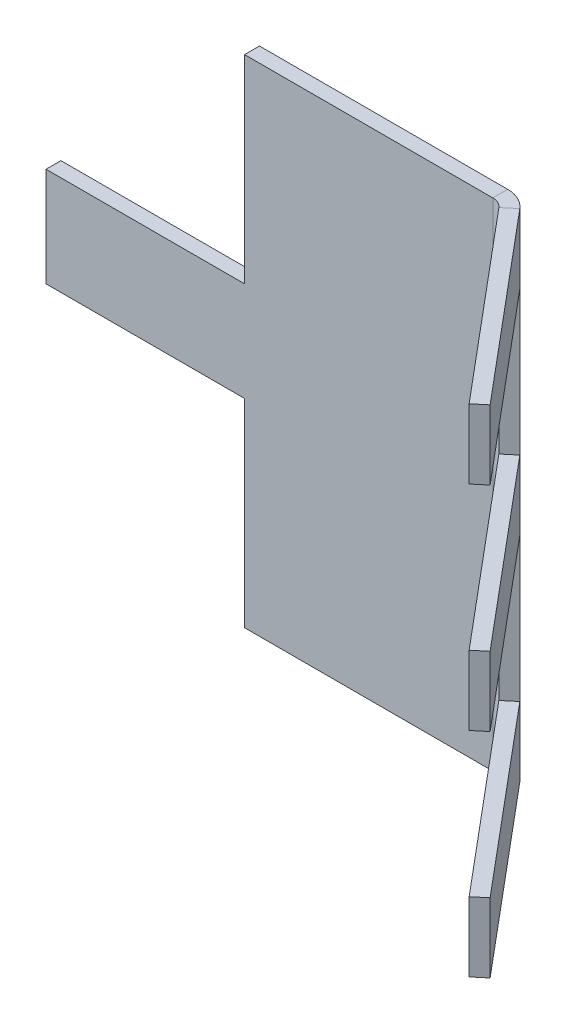
ISO-10303-21;
HEADER;
FILE_DESCRIPTION(('STEP AP214'),'2;1');
FILE_NAME('part.step','',(''),(''),'','','');
FILE_SCHEMA(('AUTOMOTIVE_DESIGN { 1 0 10303 214 1 1 1 1 }'));
ENDSEC;
DATA;
#1=APPLICATION_CONTEXT('core data for automotive mechanical design processes');
#2=APPLICATION_PROTOCOL_DEFINITION('international standard','automotive_design',2000,#1);
#3=PRODUCT_CONTEXT('',#1,'mechanical');
#4=PRODUCT('Part','Part','',(#3));
#5=PRODUCT_RELATED_PRODUCT_CATEGORY('part','',(#4));
#6=PRODUCT_DEFINITION_FORMATION('','',#4);
#7=PRODUCT_DEFINITION_CONTEXT('part definition',#1,'design');
#8=PRODUCT_DEFINITION('design','',#6,#7);
#9=PRODUCT_DEFINITION_SHAPE('','',#8);
#10=(LENGTH_UNIT() NAMED_UNIT(*) SI_UNIT(.MILLI.,.METRE.));
#11=(NAMED_UNIT(*) PLANE_ANGLE_UNIT() SI_UNIT($,.RADIAN.));
#12=(NAMED_UNIT(*) SI_UNIT($,.STERADIAN.) SOLID_ANGLE_UNIT());
#13=UNCERTAINTY_MEASURE_WITH_UNIT(LENGTH_MEASURE(1.E-05),#10,'distance_accuracy_value','');
#14=(GEOMETRIC_REPRESENTATION_CONTEXT(3) GLOBAL_UNCERTAINTY_ASSIGNED_CONTEXT((#13)) GLOBAL_UNIT_ASSIGNED_CONTEXT((#10,
#11,#12)) REPRESENTATION_CONTEXT('',''));
#15=CARTESIAN_POINT('',(0.,0.,0.));
#16=DIRECTION('',(0.,0.,1.));
#17=DIRECTION('',(1.,0.,0.));
#18=AXIS2_PLACEMENT_3D('',#15,#16,#17);
#19=CARTESIAN_POINT('',(-36.5711252653928,26.963906581741,-3.));
#20=DIRECTION('',(-1.,0.,0.));
#21=DIRECTION('',(0.,-1.,0.));
#22=AXIS2_PLACEMENT_3D('',#19,#20,#21);
#23=PLANE('',#22);
#24=DIRECTION('',(0.,0.,-1.));
#25=VECTOR('',#24,1.);
#26=CARTESIAN_POINT('',(-36.5711252653928,-13.036093418259,-3.));
#27=LINE('',#26,#25);
#28=CARTESIAN_POINT('',(-36.5711252653928,-13.036093418259,0.));
#29=VERTEX_POINT('',#28);
#30=CARTESIAN_POINT('',(-36.5711252653928,-13.036093418259,-3.));
#31=VERTEX_POINT('',#30);
#32=EDGE_CURVE('E228',#29,#31,#27,.T.);
#33=ORIENTED_EDGE('',*,*,#32,.F.);
#34=DIRECTION('',(0.,-1.,0.));
#35=VECTOR('',#34,1.);
#36=CARTESIAN_POINT('',(-36.5711252653928,26.963906581741,0.));
#37=LINE('',#36,#35);
#38=CARTESIAN_POINT('',(-36.5711252653928,26.963906581741,0.));
#39=VERTEX_POINT('',#38);
#40=EDGE_CURVE('E343',#39,#29,#37,.T.);
#41=ORIENTED_EDGE('',*,*,#40,.F.);
#42=DIRECTION('',(0.,0.,1.));
#43=VECTOR('',#42,1.);
#44=CARTESIAN_POINT('',(-36.5711252653928,26.963906581741,-3.));
#45=LINE('',#44,#43);
#46=CARTESIAN_POINT('',(-36.5711252653928,26.963906581741,-3.));
#47=VERTEX_POINT('',#46);
#48=EDGE_CURVE('E354',#47,#39,#45,.T.);
#49=ORIENTED_EDGE('',*,*,#48,.F.);
#50=DIRECTION('',(0.,-1.,0.));
#51=VECTOR('',#50,1.);
#52=CARTESIAN_POINT('',(-36.5711252653928,26.963906581741,-3.));
#53=LINE('',#52,#51);
#54=EDGE_CURVE('E330',#47,#31,#53,.T.);
#55=ORIENTED_EDGE('',*,*,#54,.T.);
#56=EDGE_LOOP('',(#33,#41,#49,#55));
#57=FACE_BOUND('',#56,.T.);
#58=ADVANCED_FACE('F57',(#57),#23,.T.);
#59=CARTESIAN_POINT('',(11.5774434840165,0.,-8.54079280549512));
#60=DIRECTION('',(-0.766044443118975,0.,0.642787609686544));
#61=DIRECTION('',(0.642787609686544,0.,0.766044443118975));
#62=AXIS2_PLACEMENT_3D('',#59,#60,#61);
#63=PLANE('',#62);
#64=DIRECTION('',(0.,1.,0.));
#65=VECTOR('',#64,1.);
#66=CARTESIAN_POINT('',(18.0251413933211,-73.036093418259,-0.85672565811926));
#67=LINE('',#66,#65);
#68=CARTESIAN_POINT('',(18.0251413933211,-59.036093418259,-0.856725658119256));
#69=VERTEX_POINT('',#68);
#70=CARTESIAN_POINT('',(18.0251413933211,-73.036093418259,-0.856725658119263));
#71=VERTEX_POINT('',#70);
#72=EDGE_CURVE('E307',#69,#71,#67,.F.);
#73=ORIENTED_EDGE('',*,*,#72,.F.);
#74=DIRECTION('',(0.642787609686544,0.,0.766044443118974));
#75=VECTOR('',#74,1.);
#76=CARTESIAN_POINT('',(11.5774434840165,-59.0360934182591,-8.54079280549511));
#77=LINE('',#76,#75);
#78=CARTESIAN_POINT('',(49.2653115227563,-59.036093418259,36.3738593268891));
#79=VERTEX_POINT('',#78);
#80=EDGE_CURVE('E250',#69,#79,#77,.T.);
#81=ORIENTED_EDGE('',*,*,#80,.T.);
#82=DIRECTION('',(0.,-1.,0.));
#83=VECTOR('',#82,1.);
#84=CARTESIAN_POINT('',(49.2653115227563,0.,36.3738593268891));
#85=LINE('',#84,#83);
#86=CARTESIAN_POINT('',(49.2653115227563,-73.036093418259,36.3738593268891));
#87=VERTEX_POINT('',#86);
#88=EDGE_CURVE('E290',#79,#87,#85,.T.);
#89=ORIENTED_EDGE('',*,*,#88,.T.);
#90=DIRECTION('',(-0.642787609686544,0.,-0.766044443118975));
#91=VECTOR('',#90,1.);
#92=CARTESIAN_POINT('',(11.5774434840165,-73.036093418259,-8.54079280549512));
#93=LINE('',#92,#91);
#94=EDGE_CURVE('E283',#87,#71,#93,.T.);
#95=ORIENTED_EDGE('',*,*,#94,.T.);
#96=EDGE_LOOP('',(#73,#81,#89,#95));
#97=FACE_BOUND('',#96,.T.);
#98=ADVANCED_FACE('F420',(#97),#63,.F.);
#99=CARTESIAN_POINT('',(9.27931015465954,0.,-6.61242997643549));
#100=DIRECTION('',(-0.766044443118975,0.,0.642787609686544));
#101=DIRECTION('',(0.642787609686544,0.,0.766044443118975));
#102=AXIS2_PLACEMENT_3D('',#99,#100,#101);
#103=PLANE('',#102);
#104=DIRECTION('',(0.642787609686544,0.,0.766044443118974));
#105=VECTOR('',#104,1.);
#106=CARTESIAN_POINT('',(46.9671781933994,-59.036093418259,38.3022221559487));
#107=LINE('',#106,#105);
#108=CARTESIAN_POINT('',(15.7270080639642,-59.036093418259,1.07163717094037));
#109=VERTEX_POINT('',#108);
#110=CARTESIAN_POINT('',(46.9671781933994,-59.036093418259,38.3022221559487));
#111=VERTEX_POINT('',#110);
#112=EDGE_CURVE('E234',#109,#111,#107,.T.);
#113=ORIENTED_EDGE('',*,*,#112,.F.);
#114=DIRECTION('',(0.,1.,0.));
#115=VECTOR('',#114,1.);
#116=CARTESIAN_POINT('',(15.7270080639642,-73.036093418259,1.07163717094037));
#117=LINE('',#116,#115);
#118=CARTESIAN_POINT('',(15.7270080639642,-73.036093418259,1.07163717094037));
#119=VERTEX_POINT('',#118);
#120=EDGE_CURVE('E311',#119,#109,#117,.T.);
#121=ORIENTED_EDGE('',*,*,#120,.F.);
#122=DIRECTION('',(0.642787609686544,0.,0.766044443118975));
#123=VECTOR('',#122,1.);
#124=CARTESIAN_POINT('',(14.8277977090722,-73.036093418259,0.));
#125=LINE('',#124,#123);
#126=CARTESIAN_POINT('',(46.9671781933994,-73.036093418259,38.3022221559487));
#127=VERTEX_POINT('',#126);
#128=EDGE_CURVE('E293',#127,#119,#125,.F.);
#129=ORIENTED_EDGE('',*,*,#128,.F.);
#130=DIRECTION('',(0.,1.,0.));
#131=VECTOR('',#130,1.);
#132=CARTESIAN_POINT('',(46.9671781933994,-73.036093418259,38.3022221559487));
#133=LINE('',#132,#131);
#134=EDGE_CURVE('E300',#111,#127,#133,.F.);
#135=ORIENTED_EDGE('',*,*,#134,.F.);
#136=EDGE_LOOP('',(#113,#121,#129,#135));
#137=FACE_BOUND('',#136,.T.);
#138=ADVANCED_FACE('F434',(#137),#103,.T.);
#139=CARTESIAN_POINT('',(49.2653115227563,-73.036093418259,36.3738593268891));
#140=DIRECTION('',(-0.642787609686543,0.,-0.766044443118974));
#141=DIRECTION('',(-0.766044443118975,0.,0.642787609686544));
#142=AXIS2_PLACEMENT_3D('',#139,#140,#141);
#143=PLANE('',#142);
#144=ORIENTED_EDGE('',*,*,#88,.F.);
#145=DIRECTION('',(-0.766044443118974,0.,0.642787609686544));
#146=VECTOR('',#145,1.);
#147=CARTESIAN_POINT('',(69.1824670438497,-59.036093418259,19.6613814750389));
#148=LINE('',#147,#146);
#149=EDGE_CURVE('E237',#79,#111,#148,.T.);
#150=ORIENTED_EDGE('',*,*,#149,.T.);
#151=ORIENTED_EDGE('',*,*,#134,.T.);
#152=DIRECTION('',(-0.766044443118975,0.,0.642787609686544));
#153=VECTOR('',#152,1.);
#154=CARTESIAN_POINT('',(49.2653115227563,-73.036093418259,36.3738593268891));
#155=LINE('',#154,#153);
#156=EDGE_CURVE('E280',#87,#127,#155,.T.);
#157=ORIENTED_EDGE('',*,*,#156,.F.);
#158=EDGE_LOOP('',(#144,#150,#151,#157));
#159=FACE_BOUND('',#158,.T.);
#160=ADVANCED_FACE('F423',(#159),#143,.F.);
#161=CARTESIAN_POINT('',(49.2653115227563,-16.036093418259,36.3738593268891));
#162=VERTEX_POINT('',#161);
#163=CARTESIAN_POINT('',(49.2653115227563,-30.036093418259,36.3738593268891));
#164=VERTEX_POINT('',#163);
#165=EDGE_CURVE('E289',#162,#164,#85,.T.);
#166=ORIENTED_EDGE('',*,*,#165,.T.);
#167=DIRECTION('',(-0.642787609686544,0.,-0.766044443118975));
#168=VECTOR('',#167,1.);
#169=CARTESIAN_POINT('',(11.5774434840165,-30.036093418259,-8.54079280549512));
#170=LINE('',#169,#168);
#171=CARTESIAN_POINT('',(18.0251413933211,-30.036093418259,-0.856725658119255));
#172=VERTEX_POINT('',#171);
#173=EDGE_CURVE('E240',#164,#172,#170,.T.);
#174=ORIENTED_EDGE('',*,*,#173,.T.);
#175=CARTESIAN_POINT('',(18.0251413933211,-16.036093418259,-0.856725658119256));
#176=VERTEX_POINT('',#175);
#177=EDGE_CURVE('E306',#176,#172,#67,.F.);
#178=ORIENTED_EDGE('',*,*,#177,.F.);
#179=DIRECTION('',(0.642787609686544,0.,0.766044443118975));
#180=VECTOR('',#179,1.);
#181=CARTESIAN_POINT('',(11.5774434840165,-16.036093418259,-8.54079280549512));
#182=LINE('',#181,#180);
#183=EDGE_CURVE('E269',#176,#162,#182,.T.);
#184=ORIENTED_EDGE('',*,*,#183,.T.);
#185=EDGE_LOOP('',(#166,#174,#178,#184));
#186=FACE_BOUND('',#185,.T.);
#187=ADVANCED_FACE('F410',(#186),#63,.F.);
#188=DIRECTION('',(-0.642787609686544,0.,-0.766044443118974));
#189=VECTOR('',#188,1.);
#190=CARTESIAN_POINT('',(46.9671781933994,-30.036093418259,38.3022221559487));
#191=LINE('',#190,#189);
#192=CARTESIAN_POINT('',(46.9671781933994,-30.036093418259,38.3022221559487));
#193=VERTEX_POINT('',#192);
#194=CARTESIAN_POINT('',(15.7270080639642,-30.036093418259,1.07163717094038));
#195=VERTEX_POINT('',#194);
#196=EDGE_CURVE('E80',#193,#195,#191,.T.);
#197=ORIENTED_EDGE('',*,*,#196,.F.);
#198=CARTESIAN_POINT('',(46.9671781933994,-16.036093418259,38.3022221559487));
#199=VERTEX_POINT('',#198);
#200=EDGE_CURVE('E299',#199,#193,#133,.F.);
#201=ORIENTED_EDGE('',*,*,#200,.F.);
#202=DIRECTION('',(0.642787609686544,0.,0.766044443118974));
#203=VECTOR('',#202,1.);
#204=CARTESIAN_POINT('',(46.9671781933994,-16.036093418259,38.3022221559487));
#205=LINE('',#204,#203);
#206=CARTESIAN_POINT('',(15.7270080639642,-16.036093418259,1.07163717094037));
#207=VERTEX_POINT('',#206);
#208=EDGE_CURVE('E259',#207,#199,#205,.T.);
#209=ORIENTED_EDGE('',*,*,#208,.F.);
#210=EDGE_CURVE('E314',#195,#207,#117,.T.);
#211=ORIENTED_EDGE('',*,*,#210,.F.);
#212=EDGE_LOOP('',(#197,#201,#209,#211));
#213=FACE_BOUND('',#212,.T.);
#214=ADVANCED_FACE('F441',(#213),#103,.T.);
#215=ORIENTED_EDGE('',*,*,#200,.T.);
#216=DIRECTION('',(-0.766044443118974,0.,0.642787609686544));
#217=VECTOR('',#216,1.);
#218=CARTESIAN_POINT('',(69.1824670438497,-30.036093418259,19.6613814750389));
#219=LINE('',#218,#217);
#220=EDGE_CURVE('E236',#164,#193,#219,.T.);
#221=ORIENTED_EDGE('',*,*,#220,.F.);
#222=ORIENTED_EDGE('',*,*,#165,.F.);
#223=DIRECTION('',(-0.766044443118975,0.,0.642787609686544));
#224=VECTOR('',#223,1.);
#225=CARTESIAN_POINT('',(49.2653115227563,-16.036093418259,36.3738593268891));
#226=LINE('',#225,#224);
#227=EDGE_CURVE('E13',#162,#199,#226,.T.);
#228=ORIENTED_EDGE('',*,*,#227,.T.);
#229=EDGE_LOOP('',(#215,#221,#222,#228));
#230=FACE_BOUND('',#229,.T.);
#231=ADVANCED_FACE('F414',(#230),#143,.F.);
#232=DIRECTION('',(0.,0.,1.));
#233=VECTOR('',#232,1.);
#234=CARTESIAN_POINT('',(-36.5711252653928,-33.036093418259,-3.));
#235=LINE('',#234,#233);
#236=CARTESIAN_POINT('',(-36.5711252653928,-33.036093418259,-3.));
#237=VERTEX_POINT('',#236);
#238=CARTESIAN_POINT('',(-36.5711252653928,-33.036093418259,0.));
#239=VERTEX_POINT('',#238);
#240=EDGE_CURVE('E225',#237,#239,#235,.T.);
#241=ORIENTED_EDGE('',*,*,#240,.F.);
#242=CARTESIAN_POINT('',(-36.5711252653928,-73.036093418259,-3.));
#243=VERTEX_POINT('',#242);
#244=EDGE_CURVE('E212',#237,#243,#53,.T.);
#245=ORIENTED_EDGE('',*,*,#244,.T.);
#246=DIRECTION('',(0.,0.,1.));
#247=VECTOR('',#246,1.);
#248=CARTESIAN_POINT('',(-36.5711252653928,-73.036093418259,-3.));
#249=LINE('',#248,#247);
#250=CARTESIAN_POINT('',(-36.5711252653928,-73.036093418259,0.));
#251=VERTEX_POINT('',#250);
#252=EDGE_CURVE('E342',#243,#251,#249,.T.);
#253=ORIENTED_EDGE('',*,*,#252,.T.);
#254=EDGE_CURVE('E321',#239,#251,#37,.T.);
#255=ORIENTED_EDGE('',*,*,#254,.F.);
#256=EDGE_LOOP('',(#241,#245,#253,#255));
#257=FACE_BOUND('',#256,.T.);
#258=ADVANCED_FACE('F59',(#257),#23,.T.);
#259=CARTESIAN_POINT('',(-36.5711252653928,26.963906581741,-3.));
#260=DIRECTION('',(0.,1.,0.));
#261=DIRECTION('',(0.,0.,1.));
#262=AXIS2_PLACEMENT_3D('',#259,#260,#261);
#263=PLANE('',#262);
#264=DIRECTION('',(-1.,0.,0.));
#265=VECTOR('',#264,1.);
#266=CARTESIAN_POINT('',(-36.5711252653928,26.963906581741,0.));
#267=LINE('',#266,#265);
#268=CARTESIAN_POINT('',(13.4288747346072,26.963906581741,0.));
#269=VERTEX_POINT('',#268);
#270=EDGE_CURVE('E351',#269,#39,#267,.T.);
#271=ORIENTED_EDGE('',*,*,#270,.F.);
#272=DIRECTION('',(0.,0.,1.));
#273=VECTOR('',#272,1.);
#274=CARTESIAN_POINT('',(13.4288747346072,26.963906581741,-3.));
#275=LINE('',#274,#273);
#276=CARTESIAN_POINT('',(13.4288747346072,26.963906581741,-2.99999999999997));
#277=VERTEX_POINT('',#276);
#278=EDGE_CURVE('E356',#277,#269,#275,.T.);
#279=ORIENTED_EDGE('',*,*,#278,.F.);
#280=DIRECTION('',(-1.,0.,0.));
#281=VECTOR('',#280,1.);
#282=CARTESIAN_POINT('',(-36.5711252653928,26.963906581741,-3.));
#283=LINE('',#282,#281);
#284=EDGE_CURVE('E339',#277,#47,#283,.T.);
#285=ORIENTED_EDGE('',*,*,#284,.T.);
#286=ORIENTED_EDGE('',*,*,#48,.T.);
#287=EDGE_LOOP('',(#271,#279,#285,#286));
#288=FACE_BOUND('',#287,.T.);
#289=ADVANCED_FACE('F461',(#288),#263,.T.);
#290=CARTESIAN_POINT('',(-36.5711252653928,-73.036093418259,-3.));
#291=DIRECTION('',(0.,-1.,0.));
#292=DIRECTION('',(0.,0.,-1.));
#293=AXIS2_PLACEMENT_3D('',#290,#291,#292);
#294=PLANE('',#293);
#295=DIRECTION('',(1.,0.,0.));
#296=VECTOR('',#295,1.);
#297=CARTESIAN_POINT('',(-36.5711252653928,-73.036093418259,0.));
#298=LINE('',#297,#296);
#299=CARTESIAN_POINT('',(13.4288747346072,-73.036093418259,0.));
#300=VERTEX_POINT('',#299);
#301=EDGE_CURVE('E346',#251,#300,#298,.T.);
#302=ORIENTED_EDGE('',*,*,#301,.F.);
#303=ORIENTED_EDGE('',*,*,#252,.F.);
#304=DIRECTION('',(1.,0.,0.));
#305=VECTOR('',#304,1.);
#306=CARTESIAN_POINT('',(-36.5711252653928,-73.036093418259,-3.));
#307=LINE('',#306,#305);
#308=CARTESIAN_POINT('',(13.4288747346072,-73.036093418259,-3.));
#309=VERTEX_POINT('',#308);
#310=EDGE_CURVE('E333',#243,#309,#307,.T.);
#311=ORIENTED_EDGE('',*,*,#310,.T.);
#312=DIRECTION('',(0.,0.,1.));
#313=VECTOR('',#312,1.);
#314=CARTESIAN_POINT('',(13.4288747346072,-73.036093418259,-3.));
#315=LINE('',#314,#313);
#316=EDGE_CURVE('E359',#309,#300,#315,.T.);
#317=ORIENTED_EDGE('',*,*,#316,.T.);
#318=EDGE_LOOP('',(#302,#303,#311,#317));
#319=FACE_BOUND('',#318,.T.);
#320=ADVANCED_FACE('F467',(#319),#294,.T.);
#321=CARTESIAN_POINT('',(0.,0.,-3.));
#322=DIRECTION('',(0.,0.,1.));
#323=DIRECTION('',(1.,0.,0.));
#324=AXIS2_PLACEMENT_3D('',#321,#322,#323);
#325=PLANE('',#324);
#326=ORIENTED_EDGE('',*,*,#244,.F.);
#327=DIRECTION('',(1.,0.,0.));
#328=VECTOR('',#327,1.);
#329=CARTESIAN_POINT('',(3.42887473460724,-33.036093418259,-3.));
#330=LINE('',#329,#328);
#331=CARTESIAN_POINT('',(-76.5711252653928,-33.036093418259,-3.));
#332=VERTEX_POINT('',#331);
#333=EDGE_CURVE('E197',#332,#237,#330,.T.);
#334=ORIENTED_EDGE('',*,*,#333,.F.);
#335=DIRECTION('',(0.,-1.,0.));
#336=VECTOR('',#335,1.);
#337=CARTESIAN_POINT('',(-76.5711252653928,-33.036093418259,-3.));
#338=LINE('',#337,#336);
#339=CARTESIAN_POINT('',(-76.5711252653928,-13.036093418259,-3.));
#340=VERTEX_POINT('',#339);
#341=EDGE_CURVE('E210',#340,#332,#338,.T.);
#342=ORIENTED_EDGE('',*,*,#341,.F.);
#343=DIRECTION('',(-1.,0.,0.));
#344=VECTOR('',#343,1.);
#345=CARTESIAN_POINT('',(3.42887473460724,-13.036093418259,-3.));
#346=LINE('',#345,#344);
#347=EDGE_CURVE('E203',#31,#340,#346,.T.);
#348=ORIENTED_EDGE('',*,*,#347,.F.);
#349=ORIENTED_EDGE('',*,*,#54,.F.);
#350=ORIENTED_EDGE('',*,*,#284,.F.);
#351=DIRECTION('',(0.,1.,0.));
#352=VECTOR('',#351,1.);
#353=CARTESIAN_POINT('',(13.4288747346072,26.963906581741,-3.));
#354=LINE('',#353,#352);
#355=EDGE_CURVE('E336',#309,#277,#354,.T.);
#356=ORIENTED_EDGE('',*,*,#355,.F.);
#357=ORIENTED_EDGE('',*,*,#310,.F.);
#358=EDGE_LOOP('',(#326,#334,#342,#348,#349,#350,#356,#357));
#359=FACE_BOUND('',#358,.T.);
#360=ADVANCED_FACE('F208',(#359),#325,.F.);
#361=CARTESIAN_POINT('',(0.,0.,0.));
#362=DIRECTION('',(0.,0.,1.));
#363=DIRECTION('',(1.,0.,0.));
#364=AXIS2_PLACEMENT_3D('',#361,#362,#363);
#365=PLANE('',#364);
#366=ORIENTED_EDGE('',*,*,#40,.T.);
#367=DIRECTION('',(-1.,0.,0.));
#368=VECTOR('',#367,1.);
#369=CARTESIAN_POINT('',(3.42887473460724,-13.036093418259,0.));
#370=LINE('',#369,#368);
#371=CARTESIAN_POINT('',(-76.5711252653928,-13.036093418259,0.));
#372=VERTEX_POINT('',#371);
#373=EDGE_CURVE('E217',#29,#372,#370,.T.);
#374=ORIENTED_EDGE('',*,*,#373,.T.);
#375=DIRECTION('',(0.,-1.,0.));
#376=VECTOR('',#375,1.);
#377=CARTESIAN_POINT('',(-76.5711252653928,-33.036093418259,0.));
#378=LINE('',#377,#376);
#379=CARTESIAN_POINT('',(-76.5711252653928,-33.036093418259,0.));
#380=VERTEX_POINT('',#379);
#381=EDGE_CURVE('E222',#372,#380,#378,.T.);
#382=ORIENTED_EDGE('',*,*,#381,.T.);
#383=DIRECTION('',(1.,0.,0.));
#384=VECTOR('',#383,1.);
#385=CARTESIAN_POINT('',(3.42887473460724,-33.036093418259,0.));
#386=LINE('',#385,#384);
#387=EDGE_CURVE('E72',#380,#239,#386,.T.);
#388=ORIENTED_EDGE('',*,*,#387,.T.);
#389=ORIENTED_EDGE('',*,*,#254,.T.);
#390=ORIENTED_EDGE('',*,*,#301,.T.);
#391=DIRECTION('',(0.,1.,0.));
#392=VECTOR('',#391,1.);
#393=CARTESIAN_POINT('',(13.4288747346072,26.963906581741,0.));
#394=LINE('',#393,#392);
#395=EDGE_CURVE('E349',#300,#269,#394,.T.);
#396=ORIENTED_EDGE('',*,*,#395,.T.);
#397=ORIENTED_EDGE('',*,*,#270,.T.);
#398=EDGE_LOOP('',(#366,#374,#382,#388,#389,#390,#396,#397));
#399=FACE_BOUND('',#398,.T.);
#400=ADVANCED_FACE('F473',(#399),#365,.T.);
#401=CARTESIAN_POINT('',(13.4288747346072,-73.036093418259,3.));
#402=DIRECTION('',(0.,-1.,0.));
#403=DIRECTION('',(0.,0.,-1.));
#404=AXIS2_PLACEMENT_3D('',#401,#402,#403);
#405=PLANE('',#404);
#406=DIRECTION('',(-0.766044443118974,0.,0.642787609686544));
#407=VECTOR('',#406,1.);
#408=CARTESIAN_POINT('',(18.0251413933211,-73.036093418259,-0.856725658119261));
#409=LINE('',#408,#407);
#410=EDGE_CURVE('E275',#119,#71,#409,.F.);
#411=ORIENTED_EDGE('',*,*,#410,.F.);
#412=CARTESIAN_POINT('',(13.4288747346072,-73.036093418259,3.));
#413=DIRECTION('',(0.,1.,0.));
#414=DIRECTION('',(0.,0.,1.));
#415=AXIS2_PLACEMENT_3D('',#412,#413,#414);
#416=CIRCLE('',#415,3.00000000000001);
#417=EDGE_CURVE('E325',#300,#119,#416,.F.);
#418=ORIENTED_EDGE('',*,*,#417,.F.);
#419=ORIENTED_EDGE('',*,*,#316,.F.);
#420=CARTESIAN_POINT('',(13.4288747346072,-73.036093418259,3.));
#421=DIRECTION('',(0.,1.,0.));
#422=DIRECTION('',(0.,0.,1.));
#423=AXIS2_PLACEMENT_3D('',#420,#421,#422);
#424=CIRCLE('',#423,6.00000000000001);
#425=EDGE_CURVE('E318',#309,#71,#424,.F.);
#426=ORIENTED_EDGE('',*,*,#425,.T.);
#427=EDGE_LOOP('',(#411,#418,#419,#426));
#428=FACE_BOUND('',#427,.T.);
#429=ADVANCED_FACE('F429',(#428),#405,.T.);
#430=CARTESIAN_POINT('',(13.4288747346072,26.963906581741,3.00000000000004));
#431=DIRECTION('',(0.,-1.,0.));
#432=DIRECTION('',(0.,0.,-1.));
#433=AXIS2_PLACEMENT_3D('',#430,#431,#432);
#434=PLANE('',#433);
#435=CARTESIAN_POINT('',(13.4288747346072,26.963906581741,3.00000000000004));
#436=DIRECTION('',(0.,1.,0.));
#437=DIRECTION('',(0.,0.,1.));
#438=AXIS2_PLACEMENT_3D('',#435,#436,#437);
#439=CIRCLE('',#438,3.00000000000001);
#440=CARTESIAN_POINT('',(15.7270080639642,26.963906581741,1.0716371709404));
#441=VERTEX_POINT('',#440);
#442=EDGE_CURVE('E279',#441,#269,#439,.T.);
#443=ORIENTED_EDGE('',*,*,#442,.F.);
#444=DIRECTION('',(-0.766044443118974,0.,0.642787609686544));
#445=VECTOR('',#444,1.);
#446=CARTESIAN_POINT('',(15.7270080639642,26.963906581741,1.07163717094039));
#447=LINE('',#446,#445);
#448=CARTESIAN_POINT('',(18.0251413933211,26.963906581741,-0.856725658119241));
#449=VERTEX_POINT('',#448);
#450=EDGE_CURVE('E308',#441,#449,#447,.F.);
#451=ORIENTED_EDGE('',*,*,#450,.T.);
#452=CARTESIAN_POINT('',(13.4288747346072,26.963906581741,3.00000000000004));
#453=DIRECTION('',(0.,1.,0.));
#454=DIRECTION('',(0.,0.,1.));
#455=AXIS2_PLACEMENT_3D('',#452,#453,#454);
#456=CIRCLE('',#455,6.00000000000001);
#457=EDGE_CURVE('E322',#449,#277,#456,.T.);
#458=ORIENTED_EDGE('',*,*,#457,.T.);
#459=ORIENTED_EDGE('',*,*,#278,.T.);
#460=EDGE_LOOP('',(#443,#451,#458,#459));
#461=FACE_BOUND('',#460,.T.);
#462=ADVANCED_FACE('F396',(#461),#434,.F.);
#463=CARTESIAN_POINT('',(13.4288747346072,26.963906581741,3.00000000000004));
#464=DIRECTION('',(0.,1.,0.));
#465=DIRECTION('',(0.766044443118975,0.,-0.642787609686544));
#466=AXIS2_PLACEMENT_3D('',#463,#464,#465);
#467=CYLINDRICAL_SURFACE('',#466,6.00000000000001);
#468=ORIENTED_EDGE('',*,*,#355,.T.);
#469=ORIENTED_EDGE('',*,*,#457,.F.);
#470=CARTESIAN_POINT('',(18.0251413933211,12.963906581741,-0.856725658119263));
#471=VERTEX_POINT('',#470);
#472=EDGE_CURVE('E303',#449,#471,#67,.F.);
#473=ORIENTED_EDGE('',*,*,#472,.T.);
#474=DIRECTION('',(0.,-1.,0.));
#475=VECTOR('',#474,1.);
#476=CARTESIAN_POINT('',(18.0251413933211,0.,-0.856725658119262));
#477=LINE('',#476,#475);
#478=EDGE_CURVE('E272',#471,#176,#477,.T.);
#479=ORIENTED_EDGE('',*,*,#478,.T.);
#480=ORIENTED_EDGE('',*,*,#177,.T.);
#481=DIRECTION('',(0.,1.,0.));
#482=VECTOR('',#481,1.);
#483=CARTESIAN_POINT('',(18.0251413933211,26.963906581741,-0.856725658119251));
#484=LINE('',#483,#482);
#485=EDGE_CURVE('E248',#69,#172,#484,.T.);
#486=ORIENTED_EDGE('',*,*,#485,.F.);
#487=ORIENTED_EDGE('',*,*,#72,.T.);
#488=ORIENTED_EDGE('',*,*,#425,.F.);
#489=EDGE_LOOP('',(#468,#469,#473,#479,#480,#486,#487,#488));
#490=FACE_BOUND('',#489,.T.);
#491=ADVANCED_FACE('F391',(#490),#467,.T.);
#492=CARTESIAN_POINT('',(13.4288747346072,26.963906581741,3.00000000000004));
#493=DIRECTION('',(0.,1.,0.));
#494=DIRECTION('',(0.766044443118975,0.,-0.642787609686544));
#495=AXIS2_PLACEMENT_3D('',#492,#493,#494);
#496=CYLINDRICAL_SURFACE('',#495,3.00000000000001);
#497=ORIENTED_EDGE('',*,*,#395,.F.);
#498=ORIENTED_EDGE('',*,*,#417,.T.);
#499=ORIENTED_EDGE('',*,*,#120,.T.);
#500=DIRECTION('',(0.,-1.,0.));
#501=VECTOR('',#500,1.);
#502=CARTESIAN_POINT('',(15.7270080639642,-59.036093418259,1.07163717094037));
#503=LINE('',#502,#501);
#504=EDGE_CURVE('E231',#195,#109,#503,.T.);
#505=ORIENTED_EDGE('',*,*,#504,.F.);
#506=ORIENTED_EDGE('',*,*,#210,.T.);
#507=DIRECTION('',(0.,-1.,0.));
#508=VECTOR('',#507,1.);
#509=CARTESIAN_POINT('',(15.7270080639642,12.963906581741,1.07163717094037));
#510=LINE('',#509,#508);
#511=CARTESIAN_POINT('',(15.7270080639642,12.963906581741,1.07163717094037));
#512=VERTEX_POINT('',#511);
#513=EDGE_CURVE('E256',#512,#207,#510,.T.);
#514=ORIENTED_EDGE('',*,*,#513,.F.);
#515=EDGE_CURVE('E315',#512,#441,#117,.T.);
#516=ORIENTED_EDGE('',*,*,#515,.T.);
#517=ORIENTED_EDGE('',*,*,#442,.T.);
#518=EDGE_LOOP('',(#497,#498,#499,#505,#506,#514,#516,#517));
#519=FACE_BOUND('',#518,.T.);
#520=ADVANCED_FACE('F400',(#519),#496,.F.);
#521=CARTESIAN_POINT('',(49.2653115227563,26.963906581741,36.3738593268891));
#522=DIRECTION('',(0.,-1.,0.));
#523=DIRECTION('',(1.,0.,0.));
#524=AXIS2_PLACEMENT_3D('',#521,#522,#523);
#525=PLANE('',#524);
#526=ORIENTED_EDGE('',*,*,#450,.F.);
#527=DIRECTION('',(-0.642787609686544,0.,-0.766044443118974));
#528=VECTOR('',#527,1.);
#529=CARTESIAN_POINT('',(46.9671781933994,26.963906581741,38.3022221559487));
#530=LINE('',#529,#528);
#531=CARTESIAN_POINT('',(46.9671781933994,26.963906581741,38.3022221559487));
#532=VERTEX_POINT('',#531);
#533=EDGE_CURVE('E301',#441,#532,#530,.F.);
#534=ORIENTED_EDGE('',*,*,#533,.T.);
#535=DIRECTION('',(-0.766044443118975,0.,0.642787609686543));
#536=VECTOR('',#535,1.);
#537=CARTESIAN_POINT('',(49.2653115227563,26.963906581741,36.3738593268891));
#538=LINE('',#537,#536);
#539=CARTESIAN_POINT('',(49.2653115227563,26.963906581741,36.3738593268891));
#540=VERTEX_POINT('',#539);
#541=EDGE_CURVE('E276',#540,#532,#538,.T.);
#542=ORIENTED_EDGE('',*,*,#541,.F.);
#543=DIRECTION('',(0.642787609686544,0.,0.766044443118974));
#544=VECTOR('',#543,1.);
#545=CARTESIAN_POINT('',(11.5774434840165,26.963906581741,-8.54079280549512));
#546=LINE('',#545,#544);
#547=EDGE_CURVE('E291',#449,#540,#546,.T.);
#548=ORIENTED_EDGE('',*,*,#547,.F.);
#549=EDGE_LOOP('',(#526,#534,#542,#548));
#550=FACE_BOUND('',#549,.T.);
#551=ADVANCED_FACE('F376',(#550),#525,.F.);
#552=CARTESIAN_POINT('',(17.1259310384291,-73.036093418259,-1.92836282905963));
#553=DIRECTION('',(0.,1.,0.));
#554=DIRECTION('',(-1.,0.,0.));
#555=AXIS2_PLACEMENT_3D('',#552,#553,#554);
#556=PLANE('',#555);
#557=ORIENTED_EDGE('',*,*,#410,.T.);
#558=ORIENTED_EDGE('',*,*,#94,.F.);
#559=ORIENTED_EDGE('',*,*,#156,.T.);
#560=ORIENTED_EDGE('',*,*,#128,.T.);
#561=EDGE_LOOP('',(#557,#558,#559,#560));
#562=FACE_BOUND('',#561,.T.);
#563=ADVANCED_FACE('F427',(#562),#556,.F.);
#564=CARTESIAN_POINT('',(49.2653115227563,12.963906581741,36.3738593268891));
#565=VERTEX_POINT('',#564);
#566=EDGE_CURVE('E286',#540,#565,#85,.T.);
#567=ORIENTED_EDGE('',*,*,#566,.T.);
#568=DIRECTION('',(-0.642787609686544,0.,-0.766044443118975));
#569=VECTOR('',#568,1.);
#570=CARTESIAN_POINT('',(11.5774434840165,12.963906581741,-8.54079280549512));
#571=LINE('',#570,#569);
#572=EDGE_CURVE('E265',#565,#471,#571,.T.);
#573=ORIENTED_EDGE('',*,*,#572,.T.);
#574=ORIENTED_EDGE('',*,*,#472,.F.);
#575=ORIENTED_EDGE('',*,*,#547,.T.);
#576=EDGE_LOOP('',(#567,#573,#574,#575));
#577=FACE_BOUND('',#576,.T.);
#578=ADVANCED_FACE('F370',(#577),#63,.F.);
#579=DIRECTION('',(-0.642787609686544,0.,-0.766044443118974));
#580=VECTOR('',#579,1.);
#581=CARTESIAN_POINT('',(46.9671781933994,12.963906581741,38.3022221559487));
#582=LINE('',#581,#580);
#583=CARTESIAN_POINT('',(46.9671781933994,12.963906581741,38.3022221559487));
#584=VERTEX_POINT('',#583);
#585=EDGE_CURVE('E253',#584,#512,#582,.T.);
#586=ORIENTED_EDGE('',*,*,#585,.F.);
#587=EDGE_CURVE('E296',#532,#584,#133,.F.);
#588=ORIENTED_EDGE('',*,*,#587,.F.);
#589=ORIENTED_EDGE('',*,*,#533,.F.);
#590=ORIENTED_EDGE('',*,*,#515,.F.);
#591=EDGE_LOOP('',(#586,#588,#589,#590));
#592=FACE_BOUND('',#591,.T.);
#593=ADVANCED_FACE('F379',(#592),#103,.T.);
#594=ORIENTED_EDGE('',*,*,#587,.T.);
#595=DIRECTION('',(0.766044443118975,0.,-0.642787609686544));
#596=VECTOR('',#595,1.);
#597=CARTESIAN_POINT('',(49.2653115227563,12.963906581741,36.3738593268891));
#598=LINE('',#597,#596);
#599=EDGE_CURVE('E65',#584,#565,#598,.T.);
#600=ORIENTED_EDGE('',*,*,#599,.T.);
#601=ORIENTED_EDGE('',*,*,#566,.F.);
#602=ORIENTED_EDGE('',*,*,#541,.T.);
#603=EDGE_LOOP('',(#594,#600,#601,#602));
#604=FACE_BOUND('',#603,.T.);
#605=ADVANCED_FACE('F365',(#604),#143,.F.);
#606=CARTESIAN_POINT('',(37.9422969144144,12.963906581741,-17.5692035099694));
#607=DIRECTION('',(-0.642787609686544,0.,-0.766044443118974));
#608=DIRECTION('',(-0.766044443118974,0.,0.642787609686544));
#609=AXIS2_PLACEMENT_3D('',#606,#607,#608);
#610=PLANE('',#609);
#611=DIRECTION('',(-0.766044443118974,0.,0.642787609686544));
#612=VECTOR('',#611,1.);
#613=CARTESIAN_POINT('',(37.9422969144144,12.963906581741,-17.5692035099694));
#614=LINE('',#613,#612);
#615=EDGE_CURVE('E261',#471,#512,#614,.T.);
#616=ORIENTED_EDGE('',*,*,#615,.T.);
#617=ORIENTED_EDGE('',*,*,#513,.T.);
#618=DIRECTION('',(-0.766044443118974,0.,0.642787609686544));
#619=VECTOR('',#618,1.);
#620=CARTESIAN_POINT('',(37.9422969144144,-16.036093418259,-17.5692035099694));
#621=LINE('',#620,#619);
#622=EDGE_CURVE('E262',#176,#207,#621,.T.);
#623=ORIENTED_EDGE('',*,*,#622,.F.);
#624=ORIENTED_EDGE('',*,*,#478,.F.);
#625=EDGE_LOOP('',(#616,#617,#623,#624));
#626=FACE_BOUND('',#625,.T.);
#627=ADVANCED_FACE('F385',(#626),#610,.F.);
#628=CARTESIAN_POINT('',(69.1824670438497,-16.036093418259,19.6613814750389));
#629=DIRECTION('',(0.,-1.,0.));
#630=DIRECTION('',(1.,0.,0.));
#631=AXIS2_PLACEMENT_3D('',#628,#629,#630);
#632=PLANE('',#631);
#633=ORIENTED_EDGE('',*,*,#622,.T.);
#634=ORIENTED_EDGE('',*,*,#208,.T.);
#635=ORIENTED_EDGE('',*,*,#227,.F.);
#636=ORIENTED_EDGE('',*,*,#183,.F.);
#637=EDGE_LOOP('',(#633,#634,#635,#636));
#638=FACE_BOUND('',#637,.T.);
#639=ADVANCED_FACE('F406',(#638),#632,.F.);
#640=CARTESIAN_POINT('',(69.1824670438497,12.963906581741,19.6613814750389));
#641=DIRECTION('',(0.,1.,0.));
#642=DIRECTION('',(-1.,0.,0.));
#643=AXIS2_PLACEMENT_3D('',#640,#641,#642);
#644=PLANE('',#643);
#645=ORIENTED_EDGE('',*,*,#599,.F.);
#646=ORIENTED_EDGE('',*,*,#585,.T.);
#647=ORIENTED_EDGE('',*,*,#615,.F.);
#648=ORIENTED_EDGE('',*,*,#572,.F.);
#649=EDGE_LOOP('',(#645,#646,#647,#648));
#650=FACE_BOUND('',#649,.T.);
#651=ADVANCED_FACE('F383',(#650),#644,.F.);
#652=CARTESIAN_POINT('',(69.1824670438497,-59.036093418259,19.6613814750389));
#653=DIRECTION('',(0.,-1.,0.));
#654=DIRECTION('',(1.,0.,0.));
#655=AXIS2_PLACEMENT_3D('',#652,#653,#654);
#656=PLANE('',#655);
#657=DIRECTION('',(-0.766044443118974,0.,0.642787609686544));
#658=VECTOR('',#657,1.);
#659=CARTESIAN_POINT('',(37.9422969144144,-59.036093418259,-17.5692035099694));
#660=LINE('',#659,#658);
#661=EDGE_CURVE('E241',#69,#109,#660,.T.);
#662=ORIENTED_EDGE('',*,*,#661,.T.);
#663=ORIENTED_EDGE('',*,*,#112,.T.);
#664=ORIENTED_EDGE('',*,*,#149,.F.);
#665=ORIENTED_EDGE('',*,*,#80,.F.);
#666=EDGE_LOOP('',(#662,#663,#664,#665));
#667=FACE_BOUND('',#666,.T.);
#668=ADVANCED_FACE('F436',(#667),#656,.F.);
#669=CARTESIAN_POINT('',(69.1824670438497,-30.036093418259,19.6613814750389));
#670=DIRECTION('',(0.,1.,0.));
#671=DIRECTION('',(-1.,0.,0.));
#672=AXIS2_PLACEMENT_3D('',#669,#670,#671);
#673=PLANE('',#672);
#674=ORIENTED_EDGE('',*,*,#220,.T.);
#675=ORIENTED_EDGE('',*,*,#196,.T.);
#676=DIRECTION('',(-0.766044443118974,0.,0.642787609686544));
#677=VECTOR('',#676,1.);
#678=CARTESIAN_POINT('',(37.9422969144144,-30.036093418259,-17.5692035099694));
#679=LINE('',#678,#677);
#680=EDGE_CURVE('E243',#172,#195,#679,.T.);
#681=ORIENTED_EDGE('',*,*,#680,.F.);
#682=ORIENTED_EDGE('',*,*,#173,.F.);
#683=EDGE_LOOP('',(#674,#675,#681,#682));
#684=FACE_BOUND('',#683,.T.);
#685=ADVANCED_FACE('F440',(#684),#673,.F.);
#686=CARTESIAN_POINT('',(37.9422969144144,-59.036093418259,-17.5692035099694));
#687=DIRECTION('',(-0.642787609686544,0.,-0.766044443118974));
#688=DIRECTION('',(-0.766044443118974,0.,0.642787609686544));
#689=AXIS2_PLACEMENT_3D('',#686,#687,#688);
#690=PLANE('',#689);
#691=ORIENTED_EDGE('',*,*,#485,.T.);
#692=ORIENTED_EDGE('',*,*,#680,.T.);
#693=ORIENTED_EDGE('',*,*,#504,.T.);
#694=ORIENTED_EDGE('',*,*,#661,.F.);
#695=EDGE_LOOP('',(#691,#692,#693,#694));
#696=FACE_BOUND('',#695,.T.);
#697=ADVANCED_FACE('F439',(#696),#690,.F.);
#698=CARTESIAN_POINT('',(-76.5711252653928,-33.036093418259,-3.));
#699=DIRECTION('',(-1.,0.,0.));
#700=DIRECTION('',(0.,0.,1.));
#701=AXIS2_PLACEMENT_3D('',#698,#699,#700);
#702=PLANE('',#701);
#703=ORIENTED_EDGE('',*,*,#381,.F.);
#704=DIRECTION('',(0.,0.,1.));
#705=VECTOR('',#704,1.);
#706=CARTESIAN_POINT('',(-76.5711252653928,-13.036093418259,-3.));
#707=LINE('',#706,#705);
#708=EDGE_CURVE('E202',#340,#372,#707,.T.);
#709=ORIENTED_EDGE('',*,*,#708,.F.);
#710=ORIENTED_EDGE('',*,*,#341,.T.);
#711=DIRECTION('',(0.,0.,1.));
#712=VECTOR('',#711,1.);
#713=CARTESIAN_POINT('',(-76.5711252653928,-33.036093418259,-3.));
#714=LINE('',#713,#712);
#715=EDGE_CURVE('E194',#332,#380,#714,.T.);
#716=ORIENTED_EDGE('',*,*,#715,.T.);
#717=EDGE_LOOP('',(#703,#709,#710,#716));
#718=FACE_BOUND('',#717,.T.);
#719=ADVANCED_FACE('F215',(#718),#702,.T.);
#720=CARTESIAN_POINT('',(3.42887473460724,-13.036093418259,-3.));
#721=DIRECTION('',(0.,1.,0.));
#722=DIRECTION('',(-1.,0.,0.));
#723=AXIS2_PLACEMENT_3D('',#720,#721,#722);
#724=PLANE('',#723);
#725=ORIENTED_EDGE('',*,*,#373,.F.);
#726=ORIENTED_EDGE('',*,*,#32,.T.);
#727=ORIENTED_EDGE('',*,*,#347,.T.);
#728=ORIENTED_EDGE('',*,*,#708,.T.);
#729=EDGE_LOOP('',(#725,#726,#727,#728));
#730=FACE_BOUND('',#729,.T.);
#731=ADVANCED_FACE('F479',(#730),#724,.T.);
#732=CARTESIAN_POINT('',(3.42887473460724,-33.036093418259,-3.));
#733=DIRECTION('',(0.,-1.,0.));
#734=DIRECTION('',(1.,0.,0.));
#735=AXIS2_PLACEMENT_3D('',#732,#733,#734);
#736=PLANE('',#735);
#737=ORIENTED_EDGE('',*,*,#333,.T.);
#738=ORIENTED_EDGE('',*,*,#240,.T.);
#739=ORIENTED_EDGE('',*,*,#387,.F.);
#740=ORIENTED_EDGE('',*,*,#715,.F.);
#741=EDGE_LOOP('',(#737,#738,#739,#740));
#742=FACE_BOUND('',#741,.T.);
#743=ADVANCED_FACE('F196',(#742),#736,.T.);
#744=CLOSED_SHELL('',(#58,#98,#138,#160,#187,#214,#231,#258,#289,#320,#360,#400,#429,#462,#491,
#520,#551,#563,#578,#593,#605,#627,#639,#651,#668,#685,#697,#719,#731,#743));
#745=MANIFOLD_SOLID_BREP('B2',#744);
#746=ADVANCED_BREP_SHAPE_REPRESENTATION('',(#18,#745),#14);
#747=SHAPE_DEFINITION_REPRESENTATION(#9,#746);
ENDSEC;
END-ISO-10303-21;
